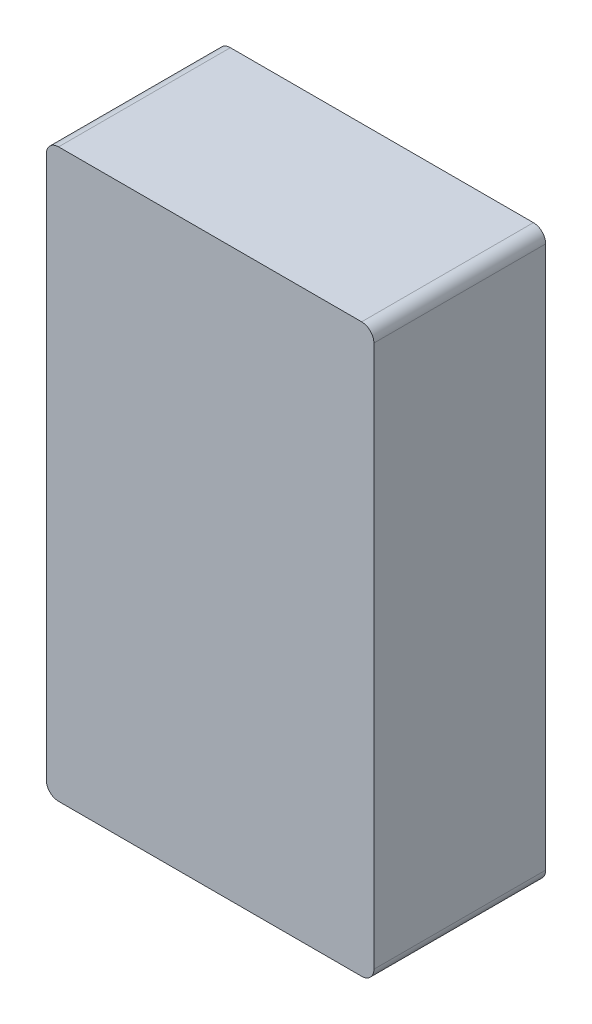
ISO-10303-21;
HEADER;
FILE_DESCRIPTION(('STEP AP214'),'2;1');
FILE_NAME('part.step','',(''),(''),'','','');
FILE_SCHEMA(('AUTOMOTIVE_DESIGN { 1 0 10303 214 1 1 1 1 }'));
ENDSEC;
DATA;
#1=APPLICATION_CONTEXT('core data for automotive mechanical design processes');
#2=APPLICATION_PROTOCOL_DEFINITION('international standard','automotive_design',2000,#1);
#3=PRODUCT_CONTEXT('',#1,'mechanical');
#4=PRODUCT('Part','Part','',(#3));
#5=PRODUCT_RELATED_PRODUCT_CATEGORY('part','',(#4));
#6=PRODUCT_DEFINITION_FORMATION('','',#4);
#7=PRODUCT_DEFINITION_CONTEXT('part definition',#1,'design');
#8=PRODUCT_DEFINITION('design','',#6,#7);
#9=PRODUCT_DEFINITION_SHAPE('','',#8);
#10=(LENGTH_UNIT() NAMED_UNIT(*) SI_UNIT(.MILLI.,.METRE.));
#11=(NAMED_UNIT(*) PLANE_ANGLE_UNIT() SI_UNIT($,.RADIAN.));
#12=(NAMED_UNIT(*) SI_UNIT($,.STERADIAN.) SOLID_ANGLE_UNIT());
#13=UNCERTAINTY_MEASURE_WITH_UNIT(LENGTH_MEASURE(1.E-05),#10,'distance_accuracy_value','');
#14=(GEOMETRIC_REPRESENTATION_CONTEXT(3) GLOBAL_UNCERTAINTY_ASSIGNED_CONTEXT((#13)) GLOBAL_UNIT_ASSIGNED_CONTEXT((#10,
#11,#12)) REPRESENTATION_CONTEXT('',''));
#15=CARTESIAN_POINT('',(0.,0.,0.));
#16=DIRECTION('',(0.,0.,1.));
#17=DIRECTION('',(1.,0.,0.));
#18=AXIS2_PLACEMENT_3D('',#15,#16,#17);
#19=CARTESIAN_POINT('',(-13.35,23.1,14.));
#20=DIRECTION('',(1.,0.,0.));
#21=DIRECTION('',(0.,1.,0.));
#22=AXIS2_PLACEMENT_3D('',#19,#20,#21);
#23=PLANE('',#22);
#24=DIRECTION('',(0.,-1.,0.));
#25=VECTOR('',#24,1.);
#26=CARTESIAN_POINT('',(-13.35,23.1,0.));
#27=LINE('',#26,#25);
#28=CARTESIAN_POINT('',(-13.35,22.1,0.));
#29=VERTEX_POINT('',#28);
#30=CARTESIAN_POINT('',(-13.35,-22.1,0.));
#31=VERTEX_POINT('',#30);
#32=EDGE_CURVE('E128',#29,#31,#27,.T.);
#33=ORIENTED_EDGE('',*,*,#32,.T.);
#34=DIRECTION('',(0.,0.,-1.));
#35=VECTOR('',#34,1.);
#36=CARTESIAN_POINT('',(-13.35,-22.1,14.));
#37=LINE('',#36,#35);
#38=CARTESIAN_POINT('',(-13.35,-22.1,14.));
#39=VERTEX_POINT('',#38);
#40=EDGE_CURVE('E151',#31,#39,#37,.F.);
#41=ORIENTED_EDGE('',*,*,#40,.T.);
#42=DIRECTION('',(0.,-1.,0.));
#43=VECTOR('',#42,1.);
#44=CARTESIAN_POINT('',(-13.35,23.1,14.));
#45=LINE('',#44,#43);
#46=CARTESIAN_POINT('',(-13.35,22.1,14.));
#47=VERTEX_POINT('',#46);
#48=EDGE_CURVE('E126',#47,#39,#45,.T.);
#49=ORIENTED_EDGE('',*,*,#48,.F.);
#50=DIRECTION('',(0.,0.,-1.));
#51=VECTOR('',#50,1.);
#52=CARTESIAN_POINT('',(-13.35,22.1,14.));
#53=LINE('',#52,#51);
#54=EDGE_CURVE('E148',#47,#29,#53,.T.);
#55=ORIENTED_EDGE('',*,*,#54,.T.);
#56=EDGE_LOOP('',(#33,#41,#49,#55));
#57=FACE_BOUND('',#56,.T.);
#58=ADVANCED_FACE('F33',(#57),#23,.F.);
#59=CARTESIAN_POINT('',(-13.35,-23.1,14.));
#60=DIRECTION('',(0.,1.,0.));
#61=DIRECTION('',(0.,0.,1.));
#62=AXIS2_PLACEMENT_3D('',#59,#60,#61);
#63=PLANE('',#62);
#64=DIRECTION('',(1.,0.,0.));
#65=VECTOR('',#64,1.);
#66=CARTESIAN_POINT('',(-13.35,-23.1,0.));
#67=LINE('',#66,#65);
#68=CARTESIAN_POINT('',(-12.35,-23.1,0.));
#69=VERTEX_POINT('',#68);
#70=CARTESIAN_POINT('',(12.35,-23.1,0.));
#71=VERTEX_POINT('',#70);
#72=EDGE_CURVE('E124',#69,#71,#67,.T.);
#73=ORIENTED_EDGE('',*,*,#72,.T.);
#74=DIRECTION('',(0.,0.,-1.));
#75=VECTOR('',#74,1.);
#76=CARTESIAN_POINT('',(12.35,-23.1,14.));
#77=LINE('',#76,#75);
#78=CARTESIAN_POINT('',(12.35,-23.1,14.));
#79=VERTEX_POINT('',#78);
#80=EDGE_CURVE('E103',#71,#79,#77,.F.);
#81=ORIENTED_EDGE('',*,*,#80,.T.);
#82=DIRECTION('',(1.,0.,0.));
#83=VECTOR('',#82,1.);
#84=CARTESIAN_POINT('',(-13.35,-23.1,14.));
#85=LINE('',#84,#83);
#86=CARTESIAN_POINT('',(-12.35,-23.1,14.));
#87=VERTEX_POINT('',#86);
#88=EDGE_CURVE('E167',#87,#79,#85,.T.);
#89=ORIENTED_EDGE('',*,*,#88,.F.);
#90=DIRECTION('',(0.,0.,-1.));
#91=VECTOR('',#90,1.);
#92=CARTESIAN_POINT('',(-12.35,-23.1,14.));
#93=LINE('',#92,#91);
#94=EDGE_CURVE('E108',#87,#69,#93,.T.);
#95=ORIENTED_EDGE('',*,*,#94,.T.);
#96=EDGE_LOOP('',(#73,#81,#89,#95));
#97=FACE_BOUND('',#96,.T.);
#98=ADVANCED_FACE('F184',(#97),#63,.F.);
#99=CARTESIAN_POINT('',(13.35,23.1,14.));
#100=DIRECTION('',(-1.,0.,0.));
#101=DIRECTION('',(0.,-1.,0.));
#102=AXIS2_PLACEMENT_3D('',#99,#100,#101);
#103=PLANE('',#102);
#104=DIRECTION('',(0.,1.,0.));
#105=VECTOR('',#104,1.);
#106=CARTESIAN_POINT('',(13.35,23.1,14.));
#107=LINE('',#106,#105);
#108=CARTESIAN_POINT('',(13.35,-22.1,14.));
#109=VERTEX_POINT('',#108);
#110=CARTESIAN_POINT('',(13.35,22.1,14.));
#111=VERTEX_POINT('',#110);
#112=EDGE_CURVE('E117',#109,#111,#107,.T.);
#113=ORIENTED_EDGE('',*,*,#112,.F.);
#114=DIRECTION('',(0.,0.,-1.));
#115=VECTOR('',#114,1.);
#116=CARTESIAN_POINT('',(13.35,-22.1,14.));
#117=LINE('',#116,#115);
#118=CARTESIAN_POINT('',(13.35,-22.1,0.));
#119=VERTEX_POINT('',#118);
#120=EDGE_CURVE('E102',#109,#119,#117,.T.);
#121=ORIENTED_EDGE('',*,*,#120,.T.);
#122=DIRECTION('',(0.,1.,0.));
#123=VECTOR('',#122,1.);
#124=CARTESIAN_POINT('',(13.35,23.1,0.));
#125=LINE('',#124,#123);
#126=CARTESIAN_POINT('',(13.35,22.1,0.));
#127=VERTEX_POINT('',#126);
#128=EDGE_CURVE('E115',#119,#127,#125,.T.);
#129=ORIENTED_EDGE('',*,*,#128,.T.);
#130=DIRECTION('',(0.,0.,-1.));
#131=VECTOR('',#130,1.);
#132=CARTESIAN_POINT('',(13.35,22.1,14.));
#133=LINE('',#132,#131);
#134=EDGE_CURVE('E119',#127,#111,#133,.F.);
#135=ORIENTED_EDGE('',*,*,#134,.T.);
#136=EDGE_LOOP('',(#113,#121,#129,#135));
#137=FACE_BOUND('',#136,.T.);
#138=ADVANCED_FACE('F114',(#137),#103,.F.);
#139=CARTESIAN_POINT('',(-13.35,23.1,14.));
#140=DIRECTION('',(0.,-1.,0.));
#141=DIRECTION('',(0.,0.,-1.));
#142=AXIS2_PLACEMENT_3D('',#139,#140,#141);
#143=PLANE('',#142);
#144=DIRECTION('',(-1.,0.,0.));
#145=VECTOR('',#144,1.);
#146=CARTESIAN_POINT('',(-13.35,23.1,0.));
#147=LINE('',#146,#145);
#148=CARTESIAN_POINT('',(12.35,23.1,0.));
#149=VERTEX_POINT('',#148);
#150=CARTESIAN_POINT('',(-12.35,23.1,0.));
#151=VERTEX_POINT('',#150);
#152=EDGE_CURVE('E123',#149,#151,#147,.T.);
#153=ORIENTED_EDGE('',*,*,#152,.T.);
#154=DIRECTION('',(0.,0.,-1.));
#155=VECTOR('',#154,1.);
#156=CARTESIAN_POINT('',(-12.35,23.1,14.));
#157=LINE('',#156,#155);
#158=CARTESIAN_POINT('',(-12.35,23.1,14.));
#159=VERTEX_POINT('',#158);
#160=EDGE_CURVE('E11',#151,#159,#157,.F.);
#161=ORIENTED_EDGE('',*,*,#160,.T.);
#162=DIRECTION('',(-1.,0.,0.));
#163=VECTOR('',#162,1.);
#164=CARTESIAN_POINT('',(-13.35,23.1,14.));
#165=LINE('',#164,#163);
#166=CARTESIAN_POINT('',(12.35,23.1,14.));
#167=VERTEX_POINT('',#166);
#168=EDGE_CURVE('E132',#167,#159,#165,.T.);
#169=ORIENTED_EDGE('',*,*,#168,.F.);
#170=DIRECTION('',(0.,0.,-1.));
#171=VECTOR('',#170,1.);
#172=CARTESIAN_POINT('',(12.35,23.1,14.));
#173=LINE('',#172,#171);
#174=EDGE_CURVE('E41',#167,#149,#173,.T.);
#175=ORIENTED_EDGE('',*,*,#174,.T.);
#176=EDGE_LOOP('',(#153,#161,#169,#175));
#177=FACE_BOUND('',#176,.T.);
#178=ADVANCED_FACE('F154',(#177),#143,.F.);
#179=CARTESIAN_POINT('',(0.,0.,14.));
#180=DIRECTION('',(0.,0.,1.));
#181=DIRECTION('',(1.,0.,0.));
#182=AXIS2_PLACEMENT_3D('',#179,#180,#181);
#183=PLANE('',#182);
#184=ORIENTED_EDGE('',*,*,#88,.T.);
#185=CARTESIAN_POINT('',(12.35,-22.1,14.));
#186=DIRECTION('',(0.,0.,1.));
#187=DIRECTION('',(1.,0.,0.));
#188=AXIS2_PLACEMENT_3D('',#185,#186,#187);
#189=CIRCLE('',#188,1.);
#190=EDGE_CURVE('E146',#79,#109,#189,.T.);
#191=ORIENTED_EDGE('',*,*,#190,.T.);
#192=ORIENTED_EDGE('',*,*,#112,.T.);
#193=CARTESIAN_POINT('',(12.35,22.1,14.));
#194=DIRECTION('',(0.,0.,1.));
#195=DIRECTION('',(1.,0.,0.));
#196=AXIS2_PLACEMENT_3D('',#193,#194,#195);
#197=CIRCLE('',#196,1.);
#198=EDGE_CURVE('E53',#111,#167,#197,.T.);
#199=ORIENTED_EDGE('',*,*,#198,.T.);
#200=ORIENTED_EDGE('',*,*,#168,.T.);
#201=CARTESIAN_POINT('',(-12.35,22.1,14.));
#202=DIRECTION('',(0.,0.,1.));
#203=DIRECTION('',(1.,0.,0.));
#204=AXIS2_PLACEMENT_3D('',#201,#202,#203);
#205=CIRCLE('',#204,1.);
#206=EDGE_CURVE('E142',#159,#47,#205,.T.);
#207=ORIENTED_EDGE('',*,*,#206,.T.);
#208=ORIENTED_EDGE('',*,*,#48,.T.);
#209=CARTESIAN_POINT('',(-12.35,-22.1,14.));
#210=DIRECTION('',(0.,0.,1.));
#211=DIRECTION('',(1.,0.,0.));
#212=AXIS2_PLACEMENT_3D('',#209,#210,#211);
#213=CIRCLE('',#212,1.);
#214=EDGE_CURVE('E144',#39,#87,#213,.T.);
#215=ORIENTED_EDGE('',*,*,#214,.T.);
#216=EDGE_LOOP('',(#184,#191,#192,#199,#200,#207,#208,#215));
#217=FACE_BOUND('',#216,.T.);
#218=ADVANCED_FACE('F173',(#217),#183,.T.);
#219=CARTESIAN_POINT('',(0.,0.,0.));
#220=DIRECTION('',(0.,0.,1.));
#221=DIRECTION('',(1.,0.,0.));
#222=AXIS2_PLACEMENT_3D('',#219,#220,#221);
#223=PLANE('',#222);
#224=ORIENTED_EDGE('',*,*,#128,.F.);
#225=CARTESIAN_POINT('',(12.35,-22.1,0.));
#226=DIRECTION('',(0.,0.,1.));
#227=DIRECTION('',(1.,0.,0.));
#228=AXIS2_PLACEMENT_3D('',#225,#226,#227);
#229=CIRCLE('',#228,1.);
#230=EDGE_CURVE('E98',#119,#71,#229,.F.);
#231=ORIENTED_EDGE('',*,*,#230,.T.);
#232=ORIENTED_EDGE('',*,*,#72,.F.);
#233=CARTESIAN_POINT('',(-12.35,-22.1,0.));
#234=DIRECTION('',(0.,0.,1.));
#235=DIRECTION('',(1.,0.,0.));
#236=AXIS2_PLACEMENT_3D('',#233,#234,#235);
#237=CIRCLE('',#236,1.);
#238=EDGE_CURVE('E109',#69,#31,#237,.F.);
#239=ORIENTED_EDGE('',*,*,#238,.T.);
#240=ORIENTED_EDGE('',*,*,#32,.F.);
#241=CARTESIAN_POINT('',(-12.35,22.1,0.));
#242=DIRECTION('',(0.,0.,1.));
#243=DIRECTION('',(1.,0.,0.));
#244=AXIS2_PLACEMENT_3D('',#241,#242,#243);
#245=CIRCLE('',#244,1.);
#246=EDGE_CURVE('E135',#29,#151,#245,.F.);
#247=ORIENTED_EDGE('',*,*,#246,.T.);
#248=ORIENTED_EDGE('',*,*,#152,.F.);
#249=CARTESIAN_POINT('',(12.35,22.1,0.));
#250=DIRECTION('',(0.,0.,1.));
#251=DIRECTION('',(1.,0.,0.));
#252=AXIS2_PLACEMENT_3D('',#249,#250,#251);
#253=CIRCLE('',#252,1.);
#254=EDGE_CURVE('E118',#149,#127,#253,.F.);
#255=ORIENTED_EDGE('',*,*,#254,.T.);
#256=EDGE_LOOP('',(#224,#231,#232,#239,#240,#247,#248,#255));
#257=FACE_BOUND('',#256,.T.);
#258=ADVANCED_FACE('F121',(#257),#223,.F.);
#259=CARTESIAN_POINT('',(12.35,-22.1,14.));
#260=DIRECTION('',(0.,0.,-1.));
#261=DIRECTION('',(-1.,0.,0.));
#262=AXIS2_PLACEMENT_3D('',#259,#260,#261);
#263=CYLINDRICAL_SURFACE('',#262,1.);
#264=ORIENTED_EDGE('',*,*,#190,.F.);
#265=ORIENTED_EDGE('',*,*,#80,.F.);
#266=ORIENTED_EDGE('',*,*,#230,.F.);
#267=ORIENTED_EDGE('',*,*,#120,.F.);
#268=EDGE_LOOP('',(#264,#265,#266,#267));
#269=FACE_BOUND('',#268,.T.);
#270=ADVANCED_FACE('F101',(#269),#263,.T.);
#271=CARTESIAN_POINT('',(-12.35,-22.1,14.));
#272=DIRECTION('',(0.,0.,-1.));
#273=DIRECTION('',(-1.,0.,0.));
#274=AXIS2_PLACEMENT_3D('',#271,#272,#273);
#275=CYLINDRICAL_SURFACE('',#274,1.);
#276=ORIENTED_EDGE('',*,*,#214,.F.);
#277=ORIENTED_EDGE('',*,*,#40,.F.);
#278=ORIENTED_EDGE('',*,*,#238,.F.);
#279=ORIENTED_EDGE('',*,*,#94,.F.);
#280=EDGE_LOOP('',(#276,#277,#278,#279));
#281=FACE_BOUND('',#280,.T.);
#282=ADVANCED_FACE('F195',(#281),#275,.T.);
#283=CARTESIAN_POINT('',(-12.35,22.1,14.));
#284=DIRECTION('',(0.,0.,-1.));
#285=DIRECTION('',(-1.,0.,0.));
#286=AXIS2_PLACEMENT_3D('',#283,#284,#285);
#287=CYLINDRICAL_SURFACE('',#286,1.);
#288=ORIENTED_EDGE('',*,*,#206,.F.);
#289=ORIENTED_EDGE('',*,*,#160,.F.);
#290=ORIENTED_EDGE('',*,*,#246,.F.);
#291=ORIENTED_EDGE('',*,*,#54,.F.);
#292=EDGE_LOOP('',(#288,#289,#290,#291));
#293=FACE_BOUND('',#292,.T.);
#294=ADVANCED_FACE('F161',(#293),#287,.T.);
#295=CARTESIAN_POINT('',(12.35,22.1,14.));
#296=DIRECTION('',(0.,0.,-1.));
#297=DIRECTION('',(-1.,0.,0.));
#298=AXIS2_PLACEMENT_3D('',#295,#296,#297);
#299=CYLINDRICAL_SURFACE('',#298,1.);
#300=ORIENTED_EDGE('',*,*,#198,.F.);
#301=ORIENTED_EDGE('',*,*,#134,.F.);
#302=ORIENTED_EDGE('',*,*,#254,.F.);
#303=ORIENTED_EDGE('',*,*,#174,.F.);
#304=EDGE_LOOP('',(#300,#301,#302,#303));
#305=FACE_BOUND('',#304,.T.);
#306=ADVANCED_FACE('F35',(#305),#299,.T.);
#307=CLOSED_SHELL('',(#58,#98,#138,#178,#218,#258,#270,#282,#294,#306));
#308=MANIFOLD_SOLID_BREP('B2',#307);
#309=ADVANCED_BREP_SHAPE_REPRESENTATION('',(#18,#308),#14);
#310=SHAPE_DEFINITION_REPRESENTATION(#9,#309);
ENDSEC;
END-ISO-10303-21;
